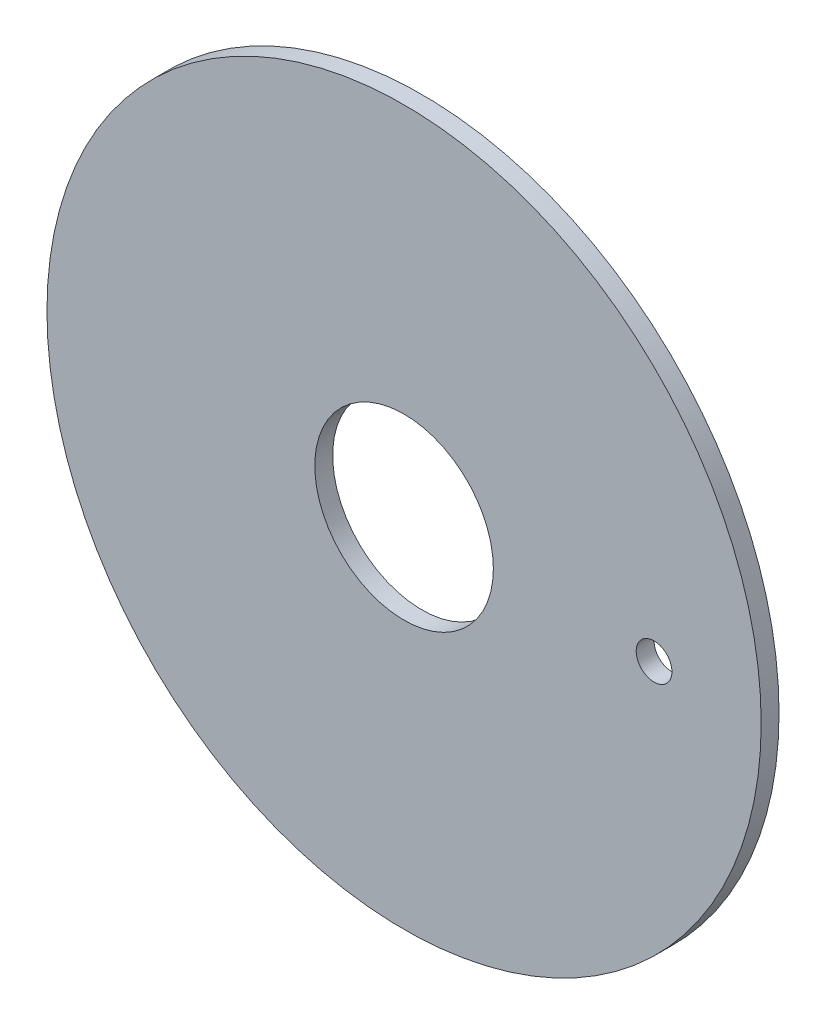
ISO-10303-21;
HEADER;
FILE_DESCRIPTION(('STEP AP214'),'2;1');
FILE_NAME('part.step','',(''),(''),'','','');
FILE_SCHEMA(('AUTOMOTIVE_DESIGN { 1 0 10303 214 1 1 1 1 }'));
ENDSEC;
DATA;
#1=APPLICATION_CONTEXT('core data for automotive mechanical design processes');
#2=APPLICATION_PROTOCOL_DEFINITION('international standard','automotive_design',2000,#1);
#3=PRODUCT_CONTEXT('',#1,'mechanical');
#4=PRODUCT('Part','Part','',(#3));
#5=PRODUCT_RELATED_PRODUCT_CATEGORY('part','',(#4));
#6=PRODUCT_DEFINITION_FORMATION('','',#4);
#7=PRODUCT_DEFINITION_CONTEXT('part definition',#1,'design');
#8=PRODUCT_DEFINITION('design','',#6,#7);
#9=PRODUCT_DEFINITION_SHAPE('','',#8);
#10=(LENGTH_UNIT() NAMED_UNIT(*) SI_UNIT(.MILLI.,.METRE.));
#11=(NAMED_UNIT(*) PLANE_ANGLE_UNIT() SI_UNIT($,.RADIAN.));
#12=(NAMED_UNIT(*) SI_UNIT($,.STERADIAN.) SOLID_ANGLE_UNIT());
#13=UNCERTAINTY_MEASURE_WITH_UNIT(LENGTH_MEASURE(1.E-05),#10,'distance_accuracy_value','');
#14=(GEOMETRIC_REPRESENTATION_CONTEXT(3) GLOBAL_UNCERTAINTY_ASSIGNED_CONTEXT((#13)) GLOBAL_UNIT_ASSIGNED_CONTEXT((#10,
#11,#12)) REPRESENTATION_CONTEXT('',''));
#15=CARTESIAN_POINT('',(0.,0.,0.));
#16=DIRECTION('',(0.,0.,1.));
#17=DIRECTION('',(1.,0.,0.));
#18=AXIS2_PLACEMENT_3D('',#15,#16,#17);
#19=CARTESIAN_POINT('',(0.,0.,5.));
#20=DIRECTION('',(0.,0.,1.));
#21=DIRECTION('',(1.,0.,0.));
#22=AXIS2_PLACEMENT_3D('',#19,#20,#21);
#23=PLANE('',#22);
#24=CARTESIAN_POINT('',(0.,0.,5.));
#25=DIRECTION('',(0.,0.,1.));
#26=DIRECTION('',(1.,0.,0.));
#27=AXIS2_PLACEMENT_3D('',#24,#25,#26);
#28=CIRCLE('',#27,25.);
#29=CARTESIAN_POINT('',(25.,0.,5.));
#30=VERTEX_POINT('',#29);
#31=EDGE_CURVE('E42',#30,#30,#28,.T.);
#32=ORIENTED_EDGE('',*,*,#31,.F.);
#33=EDGE_LOOP('',(#32));
#34=FACE_BOUND('',#33,.T.);
#35=CARTESIAN_POINT('',(0.,0.,5.));
#36=DIRECTION('',(0.,0.,1.));
#37=DIRECTION('',(1.,0.,0.));
#38=AXIS2_PLACEMENT_3D('',#35,#36,#37);
#39=CIRCLE('',#38,100.);
#40=CARTESIAN_POINT('',(100.,0.,5.));
#41=VERTEX_POINT('',#40);
#42=EDGE_CURVE('E10',#41,#41,#39,.T.);
#43=ORIENTED_EDGE('',*,*,#42,.T.);
#44=EDGE_LOOP('',(#43));
#45=FACE_BOUND('',#44,.T.);
#46=CARTESIAN_POINT('',(70.,0.,5.));
#47=DIRECTION('',(0.,0.,1.));
#48=DIRECTION('',(1.,0.,0.));
#49=AXIS2_PLACEMENT_3D('',#46,#47,#48);
#50=CIRCLE('',#49,5.);
#51=CARTESIAN_POINT('',(75.,0.,5.));
#52=VERTEX_POINT('',#51);
#53=EDGE_CURVE('E47',#52,#52,#50,.T.);
#54=ORIENTED_EDGE('',*,*,#53,.F.);
#55=EDGE_LOOP('',(#54));
#56=FACE_BOUND('',#55,.T.);
#57=ADVANCED_FACE('F31',(#34,#45,#56),#23,.T.);
#58=CARTESIAN_POINT('',(0.,0.,0.));
#59=DIRECTION('',(0.,0.,1.));
#60=DIRECTION('',(1.,0.,0.));
#61=AXIS2_PLACEMENT_3D('',#58,#59,#60);
#62=PLANE('',#61);
#63=CARTESIAN_POINT('',(0.,0.,0.));
#64=DIRECTION('',(0.,0.,1.));
#65=DIRECTION('',(1.,0.,0.));
#66=AXIS2_PLACEMENT_3D('',#63,#64,#65);
#67=CIRCLE('',#66,100.);
#68=CARTESIAN_POINT('',(100.,0.,0.));
#69=VERTEX_POINT('',#68);
#70=EDGE_CURVE('E35',#69,#69,#67,.T.);
#71=ORIENTED_EDGE('',*,*,#70,.F.);
#72=EDGE_LOOP('',(#71));
#73=FACE_BOUND('',#72,.T.);
#74=CARTESIAN_POINT('',(0.,0.,0.));
#75=DIRECTION('',(0.,0.,1.));
#76=DIRECTION('',(1.,0.,0.));
#77=AXIS2_PLACEMENT_3D('',#74,#75,#76);
#78=CIRCLE('',#77,25.);
#79=CARTESIAN_POINT('',(25.,0.,0.));
#80=VERTEX_POINT('',#79);
#81=EDGE_CURVE('E44',#80,#80,#78,.T.);
#82=ORIENTED_EDGE('',*,*,#81,.T.);
#83=EDGE_LOOP('',(#82));
#84=FACE_BOUND('',#83,.T.);
#85=CARTESIAN_POINT('',(70.,0.,0.));
#86=DIRECTION('',(0.,0.,1.));
#87=DIRECTION('',(1.,0.,0.));
#88=AXIS2_PLACEMENT_3D('',#85,#86,#87);
#89=CIRCLE('',#88,5.);
#90=CARTESIAN_POINT('',(75.,0.,0.));
#91=VERTEX_POINT('',#90);
#92=EDGE_CURVE('E50',#91,#91,#89,.T.);
#93=ORIENTED_EDGE('',*,*,#92,.T.);
#94=EDGE_LOOP('',(#93));
#95=FACE_BOUND('',#94,.T.);
#96=ADVANCED_FACE('F60',(#73,#84,#95),#62,.F.);
#97=CARTESIAN_POINT('',(0.,0.,5.));
#98=DIRECTION('',(0.,0.,-1.));
#99=DIRECTION('',(-1.,0.,0.));
#100=AXIS2_PLACEMENT_3D('',#97,#98,#99);
#101=CYLINDRICAL_SURFACE('',#100,100.);
#102=ORIENTED_EDGE('',*,*,#42,.F.);
#103=EDGE_LOOP('',(#102));
#104=FACE_BOUND('',#103,.T.);
#105=ORIENTED_EDGE('',*,*,#70,.T.);
#106=EDGE_LOOP('',(#105));
#107=FACE_BOUND('',#106,.T.);
#108=ADVANCED_FACE('F33',(#104,#107),#101,.T.);
#109=CARTESIAN_POINT('',(0.,0.,5.));
#110=DIRECTION('',(0.,0.,-1.));
#111=DIRECTION('',(-1.,0.,0.));
#112=AXIS2_PLACEMENT_3D('',#109,#110,#111);
#113=CYLINDRICAL_SURFACE('',#112,25.);
#114=ORIENTED_EDGE('',*,*,#31,.T.);
#115=EDGE_LOOP('',(#114));
#116=FACE_BOUND('',#115,.T.);
#117=ORIENTED_EDGE('',*,*,#81,.F.);
#118=EDGE_LOOP('',(#117));
#119=FACE_BOUND('',#118,.T.);
#120=ADVANCED_FACE('F69',(#116,#119),#113,.F.);
#121=CARTESIAN_POINT('',(70.,0.,5.));
#122=DIRECTION('',(0.,0.,-1.));
#123=DIRECTION('',(-1.,0.,0.));
#124=AXIS2_PLACEMENT_3D('',#121,#122,#123);
#125=CYLINDRICAL_SURFACE('',#124,5.);
#126=ORIENTED_EDGE('',*,*,#53,.T.);
#127=EDGE_LOOP('',(#126));
#128=FACE_BOUND('',#127,.T.);
#129=ORIENTED_EDGE('',*,*,#92,.F.);
#130=EDGE_LOOP('',(#129));
#131=FACE_BOUND('',#130,.T.);
#132=ADVANCED_FACE('F56',(#128,#131),#125,.F.);
#133=CLOSED_SHELL('',(#57,#96,#108,#120,#132));
#134=MANIFOLD_SOLID_BREP('B2',#133);
#135=ADVANCED_BREP_SHAPE_REPRESENTATION('',(#18,#134),#14);
#136=SHAPE_DEFINITION_REPRESENTATION(#9,#135);
ENDSEC;
END-ISO-10303-21;
